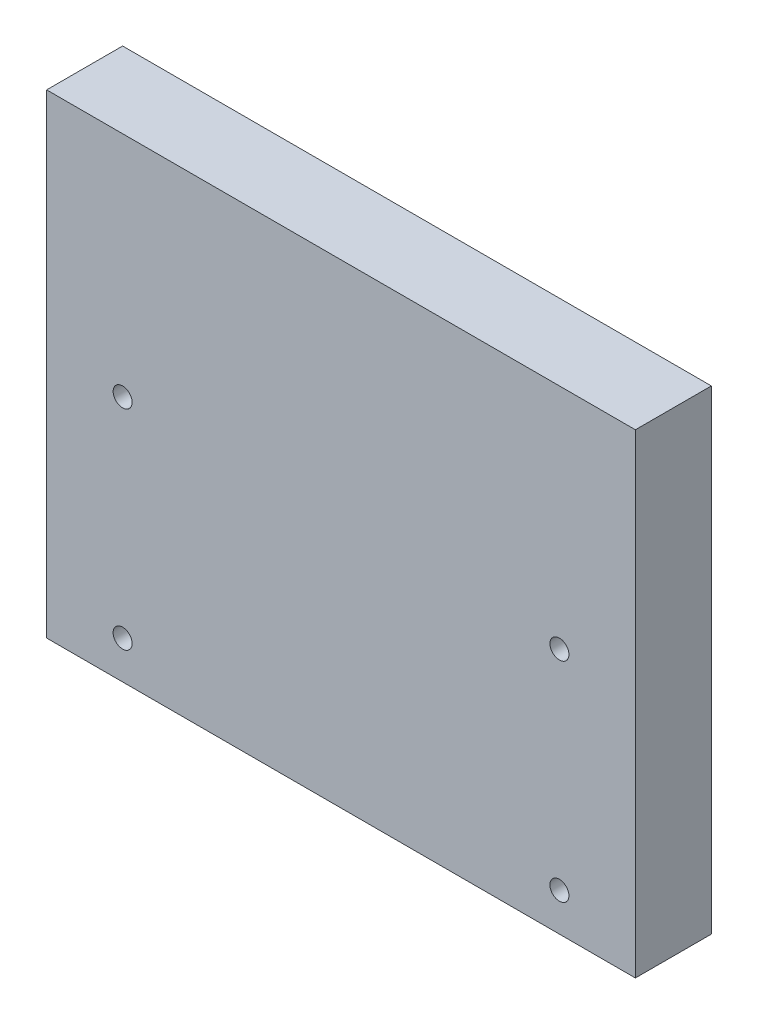
ISO-10303-21;
HEADER;
FILE_DESCRIPTION(('STEP AP214'),'2;1');
FILE_NAME('part.step','',(''),(''),'','','');
FILE_SCHEMA(('AUTOMOTIVE_DESIGN { 1 0 10303 214 1 1 1 1 }'));
ENDSEC;
DATA;
#1=APPLICATION_CONTEXT('core data for automotive mechanical design processes');
#2=APPLICATION_PROTOCOL_DEFINITION('international standard','automotive_design',2000,#1);
#3=PRODUCT_CONTEXT('',#1,'mechanical');
#4=PRODUCT('Part','Part','',(#3));
#5=PRODUCT_RELATED_PRODUCT_CATEGORY('part','',(#4));
#6=PRODUCT_DEFINITION_FORMATION('','',#4);
#7=PRODUCT_DEFINITION_CONTEXT('part definition',#1,'design');
#8=PRODUCT_DEFINITION('design','',#6,#7);
#9=PRODUCT_DEFINITION_SHAPE('','',#8);
#10=(LENGTH_UNIT() NAMED_UNIT(*) SI_UNIT(.MILLI.,.METRE.));
#11=(NAMED_UNIT(*) PLANE_ANGLE_UNIT() SI_UNIT($,.RADIAN.));
#12=(NAMED_UNIT(*) SI_UNIT($,.STERADIAN.) SOLID_ANGLE_UNIT());
#13=UNCERTAINTY_MEASURE_WITH_UNIT(LENGTH_MEASURE(1.E-05),#10,'distance_accuracy_value','');
#14=(GEOMETRIC_REPRESENTATION_CONTEXT(3) GLOBAL_UNCERTAINTY_ASSIGNED_CONTEXT((#13)) GLOBAL_UNIT_ASSIGNED_CONTEXT((#10,
#11,#12)) REPRESENTATION_CONTEXT('',''));
#15=CARTESIAN_POINT('',(0.,0.,0.));
#16=DIRECTION('',(0.,0.,1.));
#17=DIRECTION('',(1.,0.,0.));
#18=AXIS2_PLACEMENT_3D('',#15,#16,#17);
#19=CARTESIAN_POINT('',(0.,0.,8.));
#20=DIRECTION('',(0.,0.,1.));
#21=DIRECTION('',(1.,0.,0.));
#22=AXIS2_PLACEMENT_3D('',#19,#20,#21);
#23=PLANE('',#22);
#24=CARTESIAN_POINT('',(-15.3902037663905,0.775802879291236,8.));
#25=DIRECTION('',(0.,0.,1.));
#26=DIRECTION('',(-1.,0.,0.));
#27=AXIS2_PLACEMENT_3D('',#24,#25,#26);
#28=CIRCLE('',#27,1.);
#29=CARTESIAN_POINT('',(-16.3902037663905,0.775802879291236,8.));
#30=VERTEX_POINT('',#29);
#31=EDGE_CURVE('E120',#30,#30,#28,.T.);
#32=ORIENTED_EDGE('',*,*,#31,.F.);
#33=EDGE_LOOP('',(#32));
#34=FACE_BOUND('',#33,.T.);
#35=CARTESIAN_POINT('',(-15.3902037663905,-21.2241971207088,8.));
#36=DIRECTION('',(0.,0.,1.));
#37=DIRECTION('',(1.,0.,0.));
#38=AXIS2_PLACEMENT_3D('',#35,#36,#37);
#39=CIRCLE('',#38,1.);
#40=CARTESIAN_POINT('',(-14.3902037663905,-21.2241971207088,8.));
#41=VERTEX_POINT('',#40);
#42=EDGE_CURVE('E99',#41,#41,#39,.T.);
#43=ORIENTED_EDGE('',*,*,#42,.F.);
#44=EDGE_LOOP('',(#43));
#45=FACE_BOUND('',#44,.T.);
#46=DIRECTION('',(0.,-1.,0.));
#47=VECTOR('',#46,1.);
#48=CARTESIAN_POINT('',(-23.3902037663905,24.7758028792913,8.));
#49=LINE('',#48,#47);
#50=CARTESIAN_POINT('',(-23.3902037663905,24.7758028792913,8.));
#51=VERTEX_POINT('',#50);
#52=CARTESIAN_POINT('',(-23.3902037663905,-25.2241971207088,8.));
#53=VERTEX_POINT('',#52);
#54=EDGE_CURVE('E84',#51,#53,#49,.T.);
#55=ORIENTED_EDGE('',*,*,#54,.T.);
#56=DIRECTION('',(1.,0.,0.));
#57=VECTOR('',#56,1.);
#58=CARTESIAN_POINT('',(-23.3902037663905,-25.2241971207088,8.));
#59=LINE('',#58,#57);
#60=CARTESIAN_POINT('',(38.6097962336095,-25.2241971207088,8.));
#61=VERTEX_POINT('',#60);
#62=EDGE_CURVE('E79',#53,#61,#59,.T.);
#63=ORIENTED_EDGE('',*,*,#62,.T.);
#64=DIRECTION('',(0.,1.,0.));
#65=VECTOR('',#64,1.);
#66=CARTESIAN_POINT('',(38.6097962336095,24.7758028792913,8.));
#67=LINE('',#66,#65);
#68=CARTESIAN_POINT('',(38.6097962336095,24.7758028792913,8.));
#69=VERTEX_POINT('',#68);
#70=EDGE_CURVE('E82',#61,#69,#67,.T.);
#71=ORIENTED_EDGE('',*,*,#70,.T.);
#72=DIRECTION('',(-1.,0.,0.));
#73=VECTOR('',#72,1.);
#74=CARTESIAN_POINT('',(-23.3902037663905,24.7758028792913,8.));
#75=LINE('',#74,#73);
#76=EDGE_CURVE('E49',#69,#51,#75,.T.);
#77=ORIENTED_EDGE('',*,*,#76,.T.);
#78=EDGE_LOOP('',(#55,#63,#71,#77));
#79=FACE_BOUND('',#78,.T.);
#80=CARTESIAN_POINT('',(30.6097962336095,-21.2241971207088,8.));
#81=DIRECTION('',(0.,0.,1.));
#82=DIRECTION('',(-1.,0.,0.));
#83=AXIS2_PLACEMENT_3D('',#80,#81,#82);
#84=CIRCLE('',#83,1.);
#85=CARTESIAN_POINT('',(29.6097962336095,-21.2241971207088,8.));
#86=VERTEX_POINT('',#85);
#87=EDGE_CURVE('E114',#86,#86,#84,.T.);
#88=ORIENTED_EDGE('',*,*,#87,.F.);
#89=EDGE_LOOP('',(#88));
#90=FACE_BOUND('',#89,.T.);
#91=CARTESIAN_POINT('',(30.6097962336095,0.77580287929125,8.));
#92=DIRECTION('',(0.,0.,1.));
#93=DIRECTION('',(1.,0.,0.));
#94=AXIS2_PLACEMENT_3D('',#91,#92,#93);
#95=CIRCLE('',#94,1.);
#96=CARTESIAN_POINT('',(31.6097962336095,0.77580287929125,8.));
#97=VERTEX_POINT('',#96);
#98=EDGE_CURVE('E126',#97,#97,#95,.T.);
#99=ORIENTED_EDGE('',*,*,#98,.F.);
#100=EDGE_LOOP('',(#99));
#101=FACE_BOUND('',#100,.T.);
#102=ADVANCED_FACE('F32',(#34,#45,#79,#90,#101),#23,.T.);
#103=CARTESIAN_POINT('',(0.,0.,0.));
#104=DIRECTION('',(0.,0.,1.));
#105=DIRECTION('',(1.,0.,0.));
#106=AXIS2_PLACEMENT_3D('',#103,#104,#105);
#107=PLANE('',#106);
#108=CARTESIAN_POINT('',(-15.3902037663905,0.775802879291236,0.));
#109=DIRECTION('',(0.,0.,1.));
#110=DIRECTION('',(-1.,0.,0.));
#111=AXIS2_PLACEMENT_3D('',#108,#109,#110);
#112=CIRCLE('',#111,1.);
#113=CARTESIAN_POINT('',(-16.3902037663905,0.775802879291236,0.));
#114=VERTEX_POINT('',#113);
#115=EDGE_CURVE('E123',#114,#114,#112,.T.);
#116=ORIENTED_EDGE('',*,*,#115,.T.);
#117=EDGE_LOOP('',(#116));
#118=FACE_BOUND('',#117,.T.);
#119=CARTESIAN_POINT('',(-15.3902037663905,-21.2241971207088,0.));
#120=DIRECTION('',(0.,0.,1.));
#121=DIRECTION('',(1.,0.,0.));
#122=AXIS2_PLACEMENT_3D('',#119,#120,#121);
#123=CIRCLE('',#122,1.);
#124=CARTESIAN_POINT('',(-14.3902037663905,-21.2241971207088,0.));
#125=VERTEX_POINT('',#124);
#126=EDGE_CURVE('E111',#125,#125,#123,.T.);
#127=ORIENTED_EDGE('',*,*,#126,.T.);
#128=EDGE_LOOP('',(#127));
#129=FACE_BOUND('',#128,.T.);
#130=DIRECTION('',(0.,-1.,0.));
#131=VECTOR('',#130,1.);
#132=CARTESIAN_POINT('',(-23.3902037663905,24.7758028792913,0.));
#133=LINE('',#132,#131);
#134=CARTESIAN_POINT('',(-23.3902037663905,24.7758028792913,0.));
#135=VERTEX_POINT('',#134);
#136=CARTESIAN_POINT('',(-23.3902037663905,-25.2241971207088,0.));
#137=VERTEX_POINT('',#136);
#138=EDGE_CURVE('E96',#135,#137,#133,.T.);
#139=ORIENTED_EDGE('',*,*,#138,.F.);
#140=DIRECTION('',(-1.,0.,0.));
#141=VECTOR('',#140,1.);
#142=CARTESIAN_POINT('',(-23.3902037663905,24.7758028792913,0.));
#143=LINE('',#142,#141);
#144=CARTESIAN_POINT('',(38.6097962336095,24.7758028792913,0.));
#145=VERTEX_POINT('',#144);
#146=EDGE_CURVE('E72',#145,#135,#143,.T.);
#147=ORIENTED_EDGE('',*,*,#146,.F.);
#148=DIRECTION('',(0.,1.,0.));
#149=VECTOR('',#148,1.);
#150=CARTESIAN_POINT('',(38.6097962336095,24.7758028792913,0.));
#151=LINE('',#150,#149);
#152=CARTESIAN_POINT('',(38.6097962336095,-25.2241971207088,0.));
#153=VERTEX_POINT('',#152);
#154=EDGE_CURVE('E66',#153,#145,#151,.T.);
#155=ORIENTED_EDGE('',*,*,#154,.F.);
#156=DIRECTION('',(1.,0.,0.));
#157=VECTOR('',#156,1.);
#158=CARTESIAN_POINT('',(-23.3902037663905,-25.2241971207088,0.));
#159=LINE('',#158,#157);
#160=EDGE_CURVE('E88',#137,#153,#159,.T.);
#161=ORIENTED_EDGE('',*,*,#160,.F.);
#162=EDGE_LOOP('',(#139,#147,#155,#161));
#163=FACE_BOUND('',#162,.T.);
#164=CARTESIAN_POINT('',(30.6097962336095,-21.2241971207088,0.));
#165=DIRECTION('',(0.,0.,1.));
#166=DIRECTION('',(-1.,0.,0.));
#167=AXIS2_PLACEMENT_3D('',#164,#165,#166);
#168=CIRCLE('',#167,1.);
#169=CARTESIAN_POINT('',(29.6097962336095,-21.2241971207088,0.));
#170=VERTEX_POINT('',#169);
#171=EDGE_CURVE('E117',#170,#170,#168,.T.);
#172=ORIENTED_EDGE('',*,*,#171,.T.);
#173=EDGE_LOOP('',(#172));
#174=FACE_BOUND('',#173,.T.);
#175=CARTESIAN_POINT('',(30.6097962336095,0.77580287929125,0.));
#176=DIRECTION('',(0.,0.,1.));
#177=DIRECTION('',(1.,0.,0.));
#178=AXIS2_PLACEMENT_3D('',#175,#176,#177);
#179=CIRCLE('',#178,1.);
#180=CARTESIAN_POINT('',(31.6097962336095,0.77580287929125,0.));
#181=VERTEX_POINT('',#180);
#182=EDGE_CURVE('E129',#181,#181,#179,.T.);
#183=ORIENTED_EDGE('',*,*,#182,.T.);
#184=EDGE_LOOP('',(#183));
#185=FACE_BOUND('',#184,.T.);
#186=ADVANCED_FACE('F107',(#118,#129,#163,#174,#185),#107,.F.);
#187=CARTESIAN_POINT('',(-23.3902037663905,24.7758028792913,8.));
#188=DIRECTION('',(1.,0.,0.));
#189=DIRECTION('',(0.,1.,0.));
#190=AXIS2_PLACEMENT_3D('',#187,#188,#189);
#191=PLANE('',#190);
#192=ORIENTED_EDGE('',*,*,#138,.T.);
#193=DIRECTION('',(0.,0.,-1.));
#194=VECTOR('',#193,1.);
#195=CARTESIAN_POINT('',(-23.3902037663905,-25.2241971207088,8.));
#196=LINE('',#195,#194);
#197=EDGE_CURVE('E11',#53,#137,#196,.T.);
#198=ORIENTED_EDGE('',*,*,#197,.F.);
#199=ORIENTED_EDGE('',*,*,#54,.F.);
#200=DIRECTION('',(0.,0.,-1.));
#201=VECTOR('',#200,1.);
#202=CARTESIAN_POINT('',(-23.3902037663905,24.7758028792913,8.));
#203=LINE('',#202,#201);
#204=EDGE_CURVE('E92',#51,#135,#203,.T.);
#205=ORIENTED_EDGE('',*,*,#204,.T.);
#206=EDGE_LOOP('',(#192,#198,#199,#205));
#207=FACE_BOUND('',#206,.T.);
#208=ADVANCED_FACE('F34',(#207),#191,.F.);
#209=CARTESIAN_POINT('',(-23.3902037663905,-25.2241971207088,8.));
#210=DIRECTION('',(0.,1.,0.));
#211=DIRECTION('',(-1.,0.,0.));
#212=AXIS2_PLACEMENT_3D('',#209,#210,#211);
#213=PLANE('',#212);
#214=ORIENTED_EDGE('',*,*,#160,.T.);
#215=DIRECTION('',(0.,0.,-1.));
#216=VECTOR('',#215,1.);
#217=CARTESIAN_POINT('',(38.6097962336095,-25.2241971207088,8.));
#218=LINE('',#217,#216);
#219=EDGE_CURVE('E41',#61,#153,#218,.T.);
#220=ORIENTED_EDGE('',*,*,#219,.F.);
#221=ORIENTED_EDGE('',*,*,#62,.F.);
#222=ORIENTED_EDGE('',*,*,#197,.T.);
#223=EDGE_LOOP('',(#214,#220,#221,#222));
#224=FACE_BOUND('',#223,.T.);
#225=ADVANCED_FACE('F87',(#224),#213,.F.);
#226=CARTESIAN_POINT('',(38.6097962336095,24.7758028792913,8.));
#227=DIRECTION('',(-1.,0.,0.));
#228=DIRECTION('',(0.,-1.,0.));
#229=AXIS2_PLACEMENT_3D('',#226,#227,#228);
#230=PLANE('',#229);
#231=ORIENTED_EDGE('',*,*,#154,.T.);
#232=DIRECTION('',(0.,0.,-1.));
#233=VECTOR('',#232,1.);
#234=CARTESIAN_POINT('',(38.6097962336095,24.7758028792913,8.));
#235=LINE('',#234,#233);
#236=EDGE_CURVE('E89',#69,#145,#235,.T.);
#237=ORIENTED_EDGE('',*,*,#236,.F.);
#238=ORIENTED_EDGE('',*,*,#70,.F.);
#239=ORIENTED_EDGE('',*,*,#219,.T.);
#240=EDGE_LOOP('',(#231,#237,#238,#239));
#241=FACE_BOUND('',#240,.T.);
#242=ADVANCED_FACE('F90',(#241),#230,.F.);
#243=CARTESIAN_POINT('',(-23.3902037663905,24.7758028792913,8.));
#244=DIRECTION('',(0.,-1.,0.));
#245=DIRECTION('',(0.,0.,-1.));
#246=AXIS2_PLACEMENT_3D('',#243,#244,#245);
#247=PLANE('',#246);
#248=ORIENTED_EDGE('',*,*,#146,.T.);
#249=ORIENTED_EDGE('',*,*,#204,.F.);
#250=ORIENTED_EDGE('',*,*,#76,.F.);
#251=ORIENTED_EDGE('',*,*,#236,.T.);
#252=EDGE_LOOP('',(#248,#249,#250,#251));
#253=FACE_BOUND('',#252,.T.);
#254=ADVANCED_FACE('F104',(#253),#247,.F.);
#255=CARTESIAN_POINT('',(-15.3902037663905,-21.2241971207088,8.));
#256=DIRECTION('',(0.,0.,-1.));
#257=DIRECTION('',(-1.,0.,0.));
#258=AXIS2_PLACEMENT_3D('',#255,#256,#257);
#259=CYLINDRICAL_SURFACE('',#258,1.);
#260=ORIENTED_EDGE('',*,*,#42,.T.);
#261=EDGE_LOOP('',(#260));
#262=FACE_BOUND('',#261,.T.);
#263=ORIENTED_EDGE('',*,*,#126,.F.);
#264=EDGE_LOOP('',(#263));
#265=FACE_BOUND('',#264,.T.);
#266=ADVANCED_FACE('F149',(#262,#265),#259,.F.);
#267=CARTESIAN_POINT('',(30.6097962336095,-21.2241971207088,8.));
#268=DIRECTION('',(0.,0.,-1.));
#269=DIRECTION('',(-1.,0.,0.));
#270=AXIS2_PLACEMENT_3D('',#267,#268,#269);
#271=CYLINDRICAL_SURFACE('',#270,1.);
#272=ORIENTED_EDGE('',*,*,#87,.T.);
#273=EDGE_LOOP('',(#272));
#274=FACE_BOUND('',#273,.T.);
#275=ORIENTED_EDGE('',*,*,#171,.F.);
#276=EDGE_LOOP('',(#275));
#277=FACE_BOUND('',#276,.T.);
#278=ADVANCED_FACE('F195',(#274,#277),#271,.F.);
#279=CARTESIAN_POINT('',(-15.3902037663905,0.775802879291236,8.));
#280=DIRECTION('',(0.,0.,-1.));
#281=DIRECTION('',(-1.,0.,0.));
#282=AXIS2_PLACEMENT_3D('',#279,#280,#281);
#283=CYLINDRICAL_SURFACE('',#282,1.);
#284=ORIENTED_EDGE('',*,*,#31,.T.);
#285=EDGE_LOOP('',(#284));
#286=FACE_BOUND('',#285,.T.);
#287=ORIENTED_EDGE('',*,*,#115,.F.);
#288=EDGE_LOOP('',(#287));
#289=FACE_BOUND('',#288,.T.);
#290=ADVANCED_FACE('F203',(#286,#289),#283,.F.);
#291=CARTESIAN_POINT('',(30.6097962336095,0.77580287929125,8.));
#292=DIRECTION('',(0.,0.,-1.));
#293=DIRECTION('',(-1.,0.,0.));
#294=AXIS2_PLACEMENT_3D('',#291,#292,#293);
#295=CYLINDRICAL_SURFACE('',#294,1.);
#296=ORIENTED_EDGE('',*,*,#98,.T.);
#297=EDGE_LOOP('',(#296));
#298=FACE_BOUND('',#297,.T.);
#299=ORIENTED_EDGE('',*,*,#182,.F.);
#300=EDGE_LOOP('',(#299));
#301=FACE_BOUND('',#300,.T.);
#302=ADVANCED_FACE('F135',(#298,#301),#295,.F.);
#303=CLOSED_SHELL('',(#102,#186,#208,#225,#242,#254,#266,#278,#290,#302));
#304=MANIFOLD_SOLID_BREP('B2',#303);
#305=ADVANCED_BREP_SHAPE_REPRESENTATION('',(#18,#304),#14);
#306=SHAPE_DEFINITION_REPRESENTATION(#9,#305);
ENDSEC;
END-ISO-10303-21;
